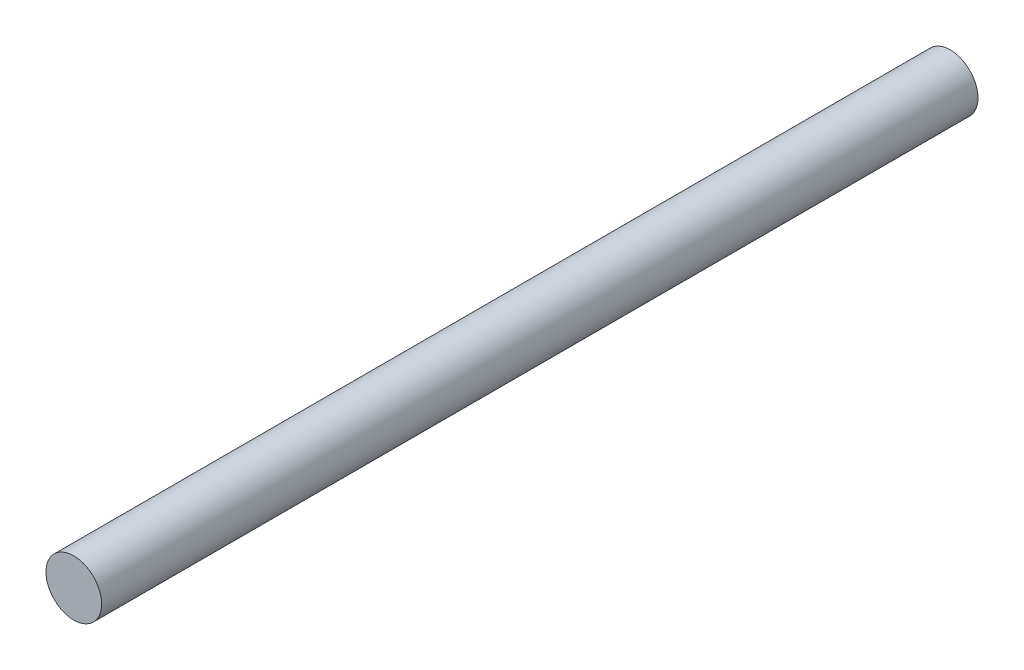
ISO-10303-21;
HEADER;
FILE_DESCRIPTION(('STEP AP214'),'2;1');
FILE_NAME('part.step','',(''),(''),'','','');
FILE_SCHEMA(('AUTOMOTIVE_DESIGN { 1 0 10303 214 1 1 1 1 }'));
ENDSEC;
DATA;
#1=APPLICATION_CONTEXT('core data for automotive mechanical design processes');
#2=APPLICATION_PROTOCOL_DEFINITION('international standard','automotive_design',2000,#1);
#3=PRODUCT_CONTEXT('',#1,'mechanical');
#4=PRODUCT('Part','Part','',(#3));
#5=PRODUCT_RELATED_PRODUCT_CATEGORY('part','',(#4));
#6=PRODUCT_DEFINITION_FORMATION('','',#4);
#7=PRODUCT_DEFINITION_CONTEXT('part definition',#1,'design');
#8=PRODUCT_DEFINITION('design','',#6,#7);
#9=PRODUCT_DEFINITION_SHAPE('','',#8);
#10=(LENGTH_UNIT() NAMED_UNIT(*) SI_UNIT(.MILLI.,.METRE.));
#11=(NAMED_UNIT(*) PLANE_ANGLE_UNIT() SI_UNIT($,.RADIAN.));
#12=(NAMED_UNIT(*) SI_UNIT($,.STERADIAN.) SOLID_ANGLE_UNIT());
#13=UNCERTAINTY_MEASURE_WITH_UNIT(LENGTH_MEASURE(1.E-05),#10,'distance_accuracy_value','');
#14=(GEOMETRIC_REPRESENTATION_CONTEXT(3) GLOBAL_UNCERTAINTY_ASSIGNED_CONTEXT((#13)) GLOBAL_UNIT_ASSIGNED_CONTEXT((#10,
#11,#12)) REPRESENTATION_CONTEXT('',''));
#15=CARTESIAN_POINT('',(0.,0.,0.));
#16=DIRECTION('',(0.,0.,1.));
#17=DIRECTION('',(1.,0.,0.));
#18=AXIS2_PLACEMENT_3D('',#15,#16,#17);
#19=CARTESIAN_POINT('',(125.614886661776,32.8357872861083,300.));
#20=DIRECTION('',(0.,0.,-1.));
#21=DIRECTION('',(-1.,0.,0.));
#22=AXIS2_PLACEMENT_3D('',#19,#20,#21);
#23=CYLINDRICAL_SURFACE('',#22,9.525);
#24=CARTESIAN_POINT('',(125.614886661776,32.8357872861083,300.));
#25=DIRECTION('',(0.,0.,1.));
#26=DIRECTION('',(1.,0.,0.));
#27=AXIS2_PLACEMENT_3D('',#24,#25,#26);
#28=CIRCLE('',#27,9.525);
#29=CARTESIAN_POINT('',(135.139886661776,32.8357872861083,300.));
#30=VERTEX_POINT('',#29);
#31=EDGE_CURVE('E10',#30,#30,#28,.T.);
#32=ORIENTED_EDGE('',*,*,#31,.F.);
#33=EDGE_LOOP('',(#32));
#34=FACE_BOUND('',#33,.T.);
#35=CARTESIAN_POINT('',(125.614886661776,32.8357872861083,0.));
#36=DIRECTION('',(0.,0.,1.));
#37=DIRECTION('',(1.,0.,0.));
#38=AXIS2_PLACEMENT_3D('',#35,#36,#37);
#39=CIRCLE('',#38,9.525);
#40=CARTESIAN_POINT('',(135.139886661776,32.8357872861083,0.));
#41=VERTEX_POINT('',#40);
#42=EDGE_CURVE('E34',#41,#41,#39,.T.);
#43=ORIENTED_EDGE('',*,*,#42,.T.);
#44=EDGE_LOOP('',(#43));
#45=FACE_BOUND('',#44,.T.);
#46=ADVANCED_FACE('F31',(#34,#45),#23,.T.);
#47=CARTESIAN_POINT('',(125.614886661776,32.8357872861083,300.));
#48=DIRECTION('',(0.,0.,1.));
#49=DIRECTION('',(1.,0.,0.));
#50=AXIS2_PLACEMENT_3D('',#47,#48,#49);
#51=PLANE('',#50);
#52=ORIENTED_EDGE('',*,*,#31,.T.);
#53=EDGE_LOOP('',(#52));
#54=FACE_BOUND('',#53,.T.);
#55=ADVANCED_FACE('F46',(#54),#51,.T.);
#56=CARTESIAN_POINT('',(125.614886661776,32.8357872861083,0.));
#57=DIRECTION('',(0.,0.,1.));
#58=DIRECTION('',(1.,0.,0.));
#59=AXIS2_PLACEMENT_3D('',#56,#57,#58);
#60=PLANE('',#59);
#61=ORIENTED_EDGE('',*,*,#42,.F.);
#62=EDGE_LOOP('',(#61));
#63=FACE_BOUND('',#62,.T.);
#64=ADVANCED_FACE('F44',(#63),#60,.F.);
#65=CLOSED_SHELL('',(#46,#55,#64));
#66=MANIFOLD_SOLID_BREP('B2',#65);
#67=ADVANCED_BREP_SHAPE_REPRESENTATION('',(#18,#66),#14);
#68=SHAPE_DEFINITION_REPRESENTATION(#9,#67);
ENDSEC;
END-ISO-10303-21;
